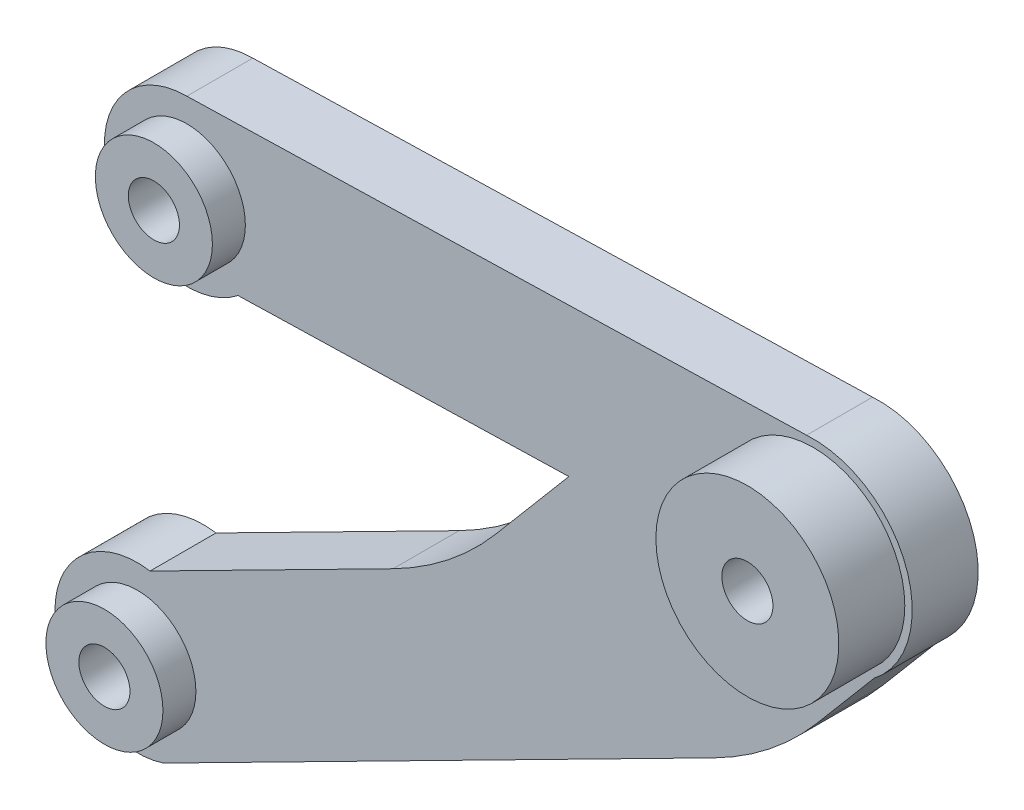
ISO-10303-21;
HEADER;
FILE_DESCRIPTION(('STEP AP214'),'2;1');
FILE_NAME('part.step','',(''),(''),'','','');
FILE_SCHEMA(('AUTOMOTIVE_DESIGN { 1 0 10303 214 1 1 1 1 }'));
ENDSEC;
DATA;
#1=APPLICATION_CONTEXT('core data for automotive mechanical design processes');
#2=APPLICATION_PROTOCOL_DEFINITION('international standard','automotive_design',2000,#1);
#3=PRODUCT_CONTEXT('',#1,'mechanical');
#4=PRODUCT('Part','Part','',(#3));
#5=PRODUCT_RELATED_PRODUCT_CATEGORY('part','',(#4));
#6=PRODUCT_DEFINITION_FORMATION('','',#4);
#7=PRODUCT_DEFINITION_CONTEXT('part definition',#1,'design');
#8=PRODUCT_DEFINITION('design','',#6,#7);
#9=PRODUCT_DEFINITION_SHAPE('','',#8);
#10=(LENGTH_UNIT() NAMED_UNIT(*) SI_UNIT(.MILLI.,.METRE.));
#11=(NAMED_UNIT(*) PLANE_ANGLE_UNIT() SI_UNIT($,.RADIAN.));
#12=(NAMED_UNIT(*) SI_UNIT($,.STERADIAN.) SOLID_ANGLE_UNIT());
#13=UNCERTAINTY_MEASURE_WITH_UNIT(LENGTH_MEASURE(1.E-05),#10,'distance_accuracy_value','');
#14=(GEOMETRIC_REPRESENTATION_CONTEXT(3) GLOBAL_UNCERTAINTY_ASSIGNED_CONTEXT((#13)) GLOBAL_UNIT_ASSIGNED_CONTEXT((#10,
#11,#12)) REPRESENTATION_CONTEXT('',''));
#15=CARTESIAN_POINT('',(0.,0.,0.));
#16=DIRECTION('',(0.,0.,1.));
#17=DIRECTION('',(1.,0.,0.));
#18=AXIS2_PLACEMENT_3D('',#15,#16,#17);
#19=CARTESIAN_POINT('',(0.,0.,2.));
#20=DIRECTION('',(0.,0.,1.));
#21=DIRECTION('',(1.,0.,0.));
#22=AXIS2_PLACEMENT_3D('',#19,#20,#21);
#23=PLANE('',#22);
#24=CARTESIAN_POINT('',(3.,26.,2.));
#25=DIRECTION('',(0.,0.,1.));
#26=DIRECTION('',(1.,0.,0.));
#27=AXIS2_PLACEMENT_3D('',#24,#25,#26);
#28=CIRCLE('',#27,3.54999999999999);
#29=CARTESIAN_POINT('',(6.55,26.,2.));
#30=VERTEX_POINT('',#29);
#31=EDGE_CURVE('E297',#30,#30,#28,.T.);
#32=ORIENTED_EDGE('',*,*,#31,.F.);
#33=EDGE_LOOP('',(#32));
#34=FACE_BOUND('',#33,.T.);
#35=CARTESIAN_POINT('',(41.,26.,2.));
#36=DIRECTION('',(0.,0.,1.));
#37=DIRECTION('',(1.,0.,0.));
#38=AXIS2_PLACEMENT_3D('',#35,#36,#37);
#39=CIRCLE('',#38,5.55);
#40=CARTESIAN_POINT('',(46.55,26.,2.));
#41=VERTEX_POINT('',#40);
#42=EDGE_CURVE('E11',#41,#41,#39,.T.);
#43=ORIENTED_EDGE('',*,*,#42,.F.);
#44=EDGE_LOOP('',(#43));
#45=FACE_BOUND('',#44,.T.);
#46=DIRECTION('',(0.891480958883719,0.453058163978715,0.));
#47=VECTOR('',#46,1.);
#48=CARTESIAN_POINT('',(2.23999683430465,-4.40763390776514,2.));
#49=LINE('',#48,#47);
#50=CARTESIAN_POINT('',(1.57575227360064,-4.74520861208887,2.));
#51=VERTEX_POINT('',#50);
#52=CARTESIAN_POINT('',(34.9980311497331,12.2402762181937,2.));
#53=VERTEX_POINT('',#52);
#54=EDGE_CURVE('E158',#51,#53,#49,.T.);
#55=ORIENTED_EDGE('',*,*,#54,.T.);
#56=CARTESIAN_POINT('',(25.9368678701588,30.0698953958681,2.));
#57=DIRECTION('',(0.,0.,1.));
#58=DIRECTION('',(1.,0.,0.));
#59=AXIS2_PLACEMENT_3D('',#56,#57,#58);
#60=CIRCLE('',#59,20.);
#61=CARTESIAN_POINT('',(41.2064358770203,17.1532281444509,2.));
#62=VERTEX_POINT('',#61);
#63=EDGE_CURVE('E58',#53,#62,#60,.T.);
#64=ORIENTED_EDGE('',*,*,#63,.T.);
#65=DIRECTION('',(0.645833362570859,0.763478400343073,0.));
#66=VECTOR('',#65,1.);
#67=CARTESIAN_POINT('',(15.561290611449,-13.1634380710946,2.));
#68=LINE('',#67,#66);
#69=CARTESIAN_POINT('',(44.6837485343568,21.2639682501461,2.));
#70=VERTEX_POINT('',#69);
#71=EDGE_CURVE('E160',#62,#70,#68,.T.);
#72=ORIENTED_EDGE('',*,*,#71,.T.);
#73=CARTESIAN_POINT('',(41.,26.,2.));
#74=DIRECTION('',(0.,0.,1.));
#75=DIRECTION('',(1.,0.,0.));
#76=AXIS2_PLACEMENT_3D('',#73,#74,#75);
#77=CIRCLE('',#76,6.);
#78=CARTESIAN_POINT('',(40.5908963470243,31.9860366020533,2.));
#79=VERTEX_POINT('',#78);
#80=EDGE_CURVE('E141',#70,#79,#77,.T.);
#81=ORIENTED_EDGE('',*,*,#80,.T.);
#82=DIRECTION('',(0.999656151865712,0.0262217092699197,0.));
#83=VECTOR('',#82,1.);
#84=CARTESIAN_POINT('',(-0.810530748396284,30.9000470018996,2.));
#85=LINE('',#84,#83);
#86=CARTESIAN_POINT('',(3.,31.,2.));
#87=VERTEX_POINT('',#86);
#88=EDGE_CURVE('E123',#87,#79,#85,.T.);
#89=ORIENTED_EDGE('',*,*,#88,.F.);
#90=CARTESIAN_POINT('',(3.,26.,2.));
#91=DIRECTION('',(0.,0.,1.));
#92=DIRECTION('',(1.,0.,0.));
#93=AXIS2_PLACEMENT_3D('',#90,#91,#92);
#94=CIRCLE('',#93,5.);
#95=CARTESIAN_POINT('',(6.10160747242444,22.0782617263513,2.));
#96=VERTEX_POINT('',#95);
#97=EDGE_CURVE('E132',#87,#96,#94,.T.);
#98=ORIENTED_EDGE('',*,*,#97,.T.);
#99=DIRECTION('',(0.999656151865712,0.0262217092699199,0.));
#100=VECTOR('',#99,1.);
#101=CARTESIAN_POINT('',(-0.574535364967009,21.9031416351081,2.));
#102=LINE('',#101,#100);
#103=CARTESIAN_POINT('',(26.1709607270067,22.6046954858943,2.));
#104=VERTEX_POINT('',#103);
#105=EDGE_CURVE('E136',#96,#104,#102,.T.);
#106=ORIENTED_EDGE('',*,*,#105,.T.);
#107=DIRECTION('',(-0.645833362570859,-0.763478400343073,0.));
#108=VECTOR('',#107,1.);
#109=CARTESIAN_POINT('',(4.10911460630286,-3.47593763253173,2.));
#110=LINE('',#109,#108);
#111=CARTESIAN_POINT('',(21.7239611526865,17.3476302457012,2.));
#112=VERTEX_POINT('',#111);
#113=EDGE_CURVE('E150',#104,#112,#110,.T.);
#114=ORIENTED_EDGE('',*,*,#113,.T.);
#115=CARTESIAN_POINT('',(6.45439314582508,30.2642974971184,2.));
#116=DIRECTION('',(0.,0.,1.));
#117=DIRECTION('',(1.,0.,0.));
#118=AXIS2_PLACEMENT_3D('',#115,#116,#117);
#119=CIRCLE('',#118,20.);
#120=CARTESIAN_POINT('',(15.5155564253994,12.434678319444,2.));
#121=VERTEX_POINT('',#120);
#122=EDGE_CURVE('E218',#112,#121,#119,.F.);
#123=ORIENTED_EDGE('',*,*,#122,.T.);
#124=DIRECTION('',(-0.891480958883719,-0.453058163978716,0.));
#125=VECTOR('',#124,1.);
#126=CARTESIAN_POINT('',(-1.83752664150379,3.61569472218833,2.));
#127=LINE('',#126,#125);
#128=CARTESIAN_POINT('',(0.769235560394451,4.9404733227318,2.));
#129=VERTEX_POINT('',#128);
#130=EDGE_CURVE('E153',#121,#129,#127,.T.);
#131=ORIENTED_EDGE('',*,*,#130,.T.);
#132=CARTESIAN_POINT('',(0.,0.,2.));
#133=DIRECTION('',(0.,0.,1.));
#134=DIRECTION('',(1.,0.,0.));
#135=AXIS2_PLACEMENT_3D('',#132,#133,#134);
#136=CIRCLE('',#135,5.);
#137=EDGE_CURVE('E155',#129,#51,#136,.T.);
#138=ORIENTED_EDGE('',*,*,#137,.T.);
#139=EDGE_LOOP('',(#55,#64,#72,#81,#89,#98,#106,#114,#123,#131,#138));
#140=FACE_BOUND('',#139,.T.);
#141=CARTESIAN_POINT('',(0.,0.,2.));
#142=DIRECTION('',(0.,0.,1.));
#143=DIRECTION('',(1.,0.,0.));
#144=AXIS2_PLACEMENT_3D('',#141,#142,#143);
#145=CIRCLE('',#144,3.55);
#146=CARTESIAN_POINT('',(3.55,0.,2.));
#147=VERTEX_POINT('',#146);
#148=EDGE_CURVE('E304',#147,#147,#145,.T.);
#149=ORIENTED_EDGE('',*,*,#148,.F.);
#150=EDGE_LOOP('',(#149));
#151=FACE_BOUND('',#150,.T.);
#152=ADVANCED_FACE('F35',(#34,#45,#140,#151),#23,.T.);
#153=CARTESIAN_POINT('',(-0.810530748396284,30.9000470018996,-2.));
#154=DIRECTION('',(0.0262217092699197,-0.999656151865712,0.));
#155=DIRECTION('',(0.999656151865712,0.0262217092699197,0.));
#156=AXIS2_PLACEMENT_3D('',#153,#154,#155);
#157=PLANE('',#156);
#158=DIRECTION('',(0.,0.,1.));
#159=VECTOR('',#158,1.);
#160=CARTESIAN_POINT('',(3.,31.,-2.));
#161=LINE('',#160,#159);
#162=CARTESIAN_POINT('',(3.,31.,-2.));
#163=VERTEX_POINT('',#162);
#164=EDGE_CURVE('E118',#163,#87,#161,.T.);
#165=ORIENTED_EDGE('',*,*,#164,.T.);
#166=ORIENTED_EDGE('',*,*,#88,.T.);
#167=DIRECTION('',(0.,0.,1.));
#168=VECTOR('',#167,1.);
#169=CARTESIAN_POINT('',(40.5908963470243,31.9860366020533,-2.));
#170=LINE('',#169,#168);
#171=CARTESIAN_POINT('',(40.5908963470243,31.9860366020533,-2.));
#172=VERTEX_POINT('',#171);
#173=EDGE_CURVE('E193',#172,#79,#170,.T.);
#174=ORIENTED_EDGE('',*,*,#173,.F.);
#175=DIRECTION('',(0.999656151865712,0.0262217092699197,0.));
#176=VECTOR('',#175,1.);
#177=CARTESIAN_POINT('',(-0.810530748396284,30.9000470018996,-2.));
#178=LINE('',#177,#176);
#179=EDGE_CURVE('E124',#163,#172,#178,.T.);
#180=ORIENTED_EDGE('',*,*,#179,.F.);
#181=EDGE_LOOP('',(#165,#166,#174,#180));
#182=FACE_BOUND('',#181,.T.);
#183=ADVANCED_FACE('F120',(#182),#157,.F.);
#184=CARTESIAN_POINT('',(41.,26.,-2.));
#185=DIRECTION('',(0.,0.,1.));
#186=DIRECTION('',(1.,0.,0.));
#187=AXIS2_PLACEMENT_3D('',#184,#185,#186);
#188=CYLINDRICAL_SURFACE('',#187,6.);
#189=ORIENTED_EDGE('',*,*,#173,.T.);
#190=ORIENTED_EDGE('',*,*,#80,.F.);
#191=DIRECTION('',(0.,0.,1.));
#192=VECTOR('',#191,1.);
#193=CARTESIAN_POINT('',(44.6837485343568,21.2639682501461,-2.));
#194=LINE('',#193,#192);
#195=CARTESIAN_POINT('',(44.6837485343568,21.2639682501461,-2.));
#196=VERTEX_POINT('',#195);
#197=EDGE_CURVE('E196',#196,#70,#194,.T.);
#198=ORIENTED_EDGE('',*,*,#197,.F.);
#199=CARTESIAN_POINT('',(41.,26.,-2.));
#200=DIRECTION('',(0.,0.,1.));
#201=DIRECTION('',(1.,0.,0.));
#202=AXIS2_PLACEMENT_3D('',#199,#200,#201);
#203=CIRCLE('',#202,6.);
#204=EDGE_CURVE('E129',#196,#172,#203,.T.);
#205=ORIENTED_EDGE('',*,*,#204,.T.);
#206=EDGE_LOOP('',(#189,#190,#198,#205));
#207=FACE_BOUND('',#206,.T.);
#208=ADVANCED_FACE('F251',(#207),#188,.T.);
#209=CARTESIAN_POINT('',(15.561290611449,-13.1634380710946,-2.));
#210=DIRECTION('',(0.763478400343073,-0.645833362570859,0.));
#211=DIRECTION('',(0.645833362570859,0.763478400343073,0.));
#212=AXIS2_PLACEMENT_3D('',#209,#210,#211);
#213=PLANE('',#212);
#214=ORIENTED_EDGE('',*,*,#71,.F.);
#215=DIRECTION('',(0.,0.,1.));
#216=VECTOR('',#215,1.);
#217=CARTESIAN_POINT('',(41.2064358770203,17.1532281444509,-2.));
#218=LINE('',#217,#216);
#219=CARTESIAN_POINT('',(41.2064358770203,17.1532281444509,-2.));
#220=VERTEX_POINT('',#219);
#221=EDGE_CURVE('E50',#62,#220,#218,.F.);
#222=ORIENTED_EDGE('',*,*,#221,.T.);
#223=DIRECTION('',(0.645833362570859,0.763478400343073,0.));
#224=VECTOR('',#223,1.);
#225=CARTESIAN_POINT('',(15.561290611449,-13.1634380710946,-2.));
#226=LINE('',#225,#224);
#227=EDGE_CURVE('E189',#220,#196,#226,.T.);
#228=ORIENTED_EDGE('',*,*,#227,.T.);
#229=ORIENTED_EDGE('',*,*,#197,.T.);
#230=EDGE_LOOP('',(#214,#222,#228,#229));
#231=FACE_BOUND('',#230,.T.);
#232=ADVANCED_FACE('F249',(#231),#213,.T.);
#233=CARTESIAN_POINT('',(2.23999683430465,-4.40763390776514,-2.));
#234=DIRECTION('',(0.453058163978715,-0.891480958883719,0.));
#235=DIRECTION('',(0.891480958883719,0.453058163978715,0.));
#236=AXIS2_PLACEMENT_3D('',#233,#234,#235);
#237=PLANE('',#236);
#238=DIRECTION('',(0.891480958883719,0.453058163978715,0.));
#239=VECTOR('',#238,1.);
#240=CARTESIAN_POINT('',(2.23999683430465,-4.40763390776514,-2.));
#241=LINE('',#240,#239);
#242=CARTESIAN_POINT('',(1.57575227360064,-4.74520861208887,-2.));
#243=VERTEX_POINT('',#242);
#244=CARTESIAN_POINT('',(34.9980311497331,12.2402762181937,-2.));
#245=VERTEX_POINT('',#244);
#246=EDGE_CURVE('E186',#243,#245,#241,.T.);
#247=ORIENTED_EDGE('',*,*,#246,.T.);
#248=DIRECTION('',(0.,0.,1.));
#249=VECTOR('',#248,1.);
#250=CARTESIAN_POINT('',(34.9980311497331,12.2402762181937,-2.));
#251=LINE('',#250,#249);
#252=EDGE_CURVE('E211',#245,#53,#251,.T.);
#253=ORIENTED_EDGE('',*,*,#252,.T.);
#254=ORIENTED_EDGE('',*,*,#54,.F.);
#255=DIRECTION('',(0.,0.,1.));
#256=VECTOR('',#255,1.);
#257=CARTESIAN_POINT('',(1.57575227360064,-4.74520861208887,-2.));
#258=LINE('',#257,#256);
#259=EDGE_CURVE('E199',#243,#51,#258,.T.);
#260=ORIENTED_EDGE('',*,*,#259,.F.);
#261=EDGE_LOOP('',(#247,#253,#254,#260));
#262=FACE_BOUND('',#261,.T.);
#263=ADVANCED_FACE('F242',(#262),#237,.T.);
#264=CARTESIAN_POINT('',(0.,0.,-2.));
#265=DIRECTION('',(0.,0.,1.));
#266=DIRECTION('',(1.,0.,0.));
#267=AXIS2_PLACEMENT_3D('',#264,#265,#266);
#268=CYLINDRICAL_SURFACE('',#267,5.);
#269=ORIENTED_EDGE('',*,*,#259,.T.);
#270=ORIENTED_EDGE('',*,*,#137,.F.);
#271=DIRECTION('',(0.,0.,1.));
#272=VECTOR('',#271,1.);
#273=CARTESIAN_POINT('',(0.769235560394451,4.9404733227318,-2.));
#274=LINE('',#273,#272);
#275=CARTESIAN_POINT('',(0.769235560394451,4.9404733227318,-2.));
#276=VERTEX_POINT('',#275);
#277=EDGE_CURVE('E201',#276,#129,#274,.T.);
#278=ORIENTED_EDGE('',*,*,#277,.F.);
#279=CARTESIAN_POINT('',(0.,0.,-2.));
#280=DIRECTION('',(0.,0.,1.));
#281=DIRECTION('',(1.,0.,0.));
#282=AXIS2_PLACEMENT_3D('',#279,#280,#281);
#283=CIRCLE('',#282,5.);
#284=EDGE_CURVE('E183',#276,#243,#283,.T.);
#285=ORIENTED_EDGE('',*,*,#284,.T.);
#286=EDGE_LOOP('',(#269,#270,#278,#285));
#287=FACE_BOUND('',#286,.T.);
#288=ADVANCED_FACE('F239',(#287),#268,.T.);
#289=CARTESIAN_POINT('',(-1.83752664150379,3.61569472218833,-2.));
#290=DIRECTION('',(-0.453058163978715,0.891480958883719,0.));
#291=DIRECTION('',(-0.891480958883719,-0.453058163978715,0.));
#292=AXIS2_PLACEMENT_3D('',#289,#290,#291);
#293=PLANE('',#292);
#294=ORIENTED_EDGE('',*,*,#130,.F.);
#295=DIRECTION('',(0.,0.,1.));
#296=VECTOR('',#295,1.);
#297=CARTESIAN_POINT('',(15.5155564253994,12.434678319444,-2.));
#298=LINE('',#297,#296);
#299=CARTESIAN_POINT('',(15.5155564253994,12.434678319444,-2.));
#300=VERTEX_POINT('',#299);
#301=EDGE_CURVE('E209',#121,#300,#298,.F.);
#302=ORIENTED_EDGE('',*,*,#301,.T.);
#303=DIRECTION('',(-0.891480958883719,-0.453058163978716,0.));
#304=VECTOR('',#303,1.);
#305=CARTESIAN_POINT('',(-1.83752664150379,3.61569472218833,-2.));
#306=LINE('',#305,#304);
#307=EDGE_CURVE('E181',#300,#276,#306,.T.);
#308=ORIENTED_EDGE('',*,*,#307,.T.);
#309=ORIENTED_EDGE('',*,*,#277,.T.);
#310=EDGE_LOOP('',(#294,#302,#308,#309));
#311=FACE_BOUND('',#310,.T.);
#312=ADVANCED_FACE('F235',(#311),#293,.T.);
#313=CARTESIAN_POINT('',(4.10911460630286,-3.47593763253173,-2.));
#314=DIRECTION('',(-0.763478400343073,0.645833362570859,0.));
#315=DIRECTION('',(-0.645833362570859,-0.763478400343073,0.));
#316=AXIS2_PLACEMENT_3D('',#313,#314,#315);
#317=PLANE('',#316);
#318=DIRECTION('',(-0.645833362570859,-0.763478400343073,0.));
#319=VECTOR('',#318,1.);
#320=CARTESIAN_POINT('',(4.10911460630286,-3.47593763253173,-2.));
#321=LINE('',#320,#319);
#322=CARTESIAN_POINT('',(26.1709607270067,22.6046954858943,-2.));
#323=VERTEX_POINT('',#322);
#324=CARTESIAN_POINT('',(21.7239611526865,17.3476302457012,-2.));
#325=VERTEX_POINT('',#324);
#326=EDGE_CURVE('E178',#323,#325,#321,.T.);
#327=ORIENTED_EDGE('',*,*,#326,.T.);
#328=DIRECTION('',(0.,0.,1.));
#329=VECTOR('',#328,1.);
#330=CARTESIAN_POINT('',(21.7239611526865,17.3476302457012,2.));
#331=LINE('',#330,#329);
#332=EDGE_CURVE('E195',#325,#112,#331,.T.);
#333=ORIENTED_EDGE('',*,*,#332,.T.);
#334=ORIENTED_EDGE('',*,*,#113,.F.);
#335=DIRECTION('',(0.,0.,1.));
#336=VECTOR('',#335,1.);
#337=CARTESIAN_POINT('',(26.1709607270067,22.6046954858943,-2.));
#338=LINE('',#337,#336);
#339=EDGE_CURVE('E204',#323,#104,#338,.T.);
#340=ORIENTED_EDGE('',*,*,#339,.F.);
#341=EDGE_LOOP('',(#327,#333,#334,#340));
#342=FACE_BOUND('',#341,.T.);
#343=ADVANCED_FACE('F230',(#342),#317,.T.);
#344=CARTESIAN_POINT('',(-0.574535364967009,21.9031416351081,-2.));
#345=DIRECTION('',(0.0262217092699199,-0.999656151865712,0.));
#346=DIRECTION('',(0.999656151865712,0.0262217092699199,0.));
#347=AXIS2_PLACEMENT_3D('',#344,#345,#346);
#348=PLANE('',#347);
#349=ORIENTED_EDGE('',*,*,#339,.T.);
#350=ORIENTED_EDGE('',*,*,#105,.F.);
#351=DIRECTION('',(0.,0.,1.));
#352=VECTOR('',#351,1.);
#353=CARTESIAN_POINT('',(6.10160747242444,22.0782617263513,-2.));
#354=LINE('',#353,#352);
#355=CARTESIAN_POINT('',(6.10160747242444,22.0782617263513,-2.));
#356=VERTEX_POINT('',#355);
#357=EDGE_CURVE('E128',#356,#96,#354,.T.);
#358=ORIENTED_EDGE('',*,*,#357,.F.);
#359=DIRECTION('',(0.999656151865712,0.0262217092699199,0.));
#360=VECTOR('',#359,1.);
#361=CARTESIAN_POINT('',(-0.574535364967009,21.9031416351081,-2.));
#362=LINE('',#361,#360);
#363=EDGE_CURVE('E175',#356,#323,#362,.T.);
#364=ORIENTED_EDGE('',*,*,#363,.T.);
#365=EDGE_LOOP('',(#349,#350,#358,#364));
#366=FACE_BOUND('',#365,.T.);
#367=ADVANCED_FACE('F291',(#366),#348,.T.);
#368=CARTESIAN_POINT('',(3.,26.,-2.));
#369=DIRECTION('',(0.,0.,1.));
#370=DIRECTION('',(1.,0.,0.));
#371=AXIS2_PLACEMENT_3D('',#368,#369,#370);
#372=CYLINDRICAL_SURFACE('',#371,1.54999999999999);
#373=CARTESIAN_POINT('',(3.,26.,-2.));
#374=DIRECTION('',(0.,0.,1.));
#375=DIRECTION('',(1.,0.,0.));
#376=AXIS2_PLACEMENT_3D('',#373,#374,#375);
#377=CIRCLE('',#376,1.54999999999999);
#378=CARTESIAN_POINT('',(4.54999999999999,26.,-2.));
#379=VERTEX_POINT('',#378);
#380=EDGE_CURVE('E169',#379,#379,#377,.T.);
#381=ORIENTED_EDGE('',*,*,#380,.F.);
#382=EDGE_LOOP('',(#381));
#383=FACE_BOUND('',#382,.T.);
#384=CARTESIAN_POINT('',(3.,26.,4.));
#385=DIRECTION('',(0.,0.,1.));
#386=DIRECTION('',(1.,0.,0.));
#387=AXIS2_PLACEMENT_3D('',#384,#385,#386);
#388=CIRCLE('',#387,1.54999999999999);
#389=CARTESIAN_POINT('',(4.55,26.,4.));
#390=VERTEX_POINT('',#389);
#391=EDGE_CURVE('E295',#390,#390,#388,.T.);
#392=ORIENTED_EDGE('',*,*,#391,.T.);
#393=EDGE_LOOP('',(#392));
#394=FACE_BOUND('',#393,.T.);
#395=ADVANCED_FACE('F287',(#383,#394),#372,.F.);
#396=CARTESIAN_POINT('',(41.,26.,-2.));
#397=DIRECTION('',(0.,0.,1.));
#398=DIRECTION('',(1.,0.,0.));
#399=AXIS2_PLACEMENT_3D('',#396,#397,#398);
#400=CYLINDRICAL_SURFACE('',#399,1.54999999999999);
#401=CARTESIAN_POINT('',(41.,26.,-2.));
#402=DIRECTION('',(0.,0.,1.));
#403=DIRECTION('',(1.,0.,0.));
#404=AXIS2_PLACEMENT_3D('',#401,#402,#403);
#405=CIRCLE('',#404,1.54999999999999);
#406=CARTESIAN_POINT('',(42.55,26.,-2.));
#407=VERTEX_POINT('',#406);
#408=EDGE_CURVE('E166',#407,#407,#405,.T.);
#409=ORIENTED_EDGE('',*,*,#408,.F.);
#410=EDGE_LOOP('',(#409));
#411=FACE_BOUND('',#410,.T.);
#412=CARTESIAN_POINT('',(41.,26.,6.));
#413=DIRECTION('',(0.,0.,-1.));
#414=DIRECTION('',(-1.,0.,0.));
#415=AXIS2_PLACEMENT_3D('',#412,#413,#414);
#416=CIRCLE('',#415,1.55);
#417=CARTESIAN_POINT('',(39.45,26.,6.));
#418=VERTEX_POINT('',#417);
#419=EDGE_CURVE('E145',#418,#418,#416,.T.);
#420=ORIENTED_EDGE('',*,*,#419,.F.);
#421=EDGE_LOOP('',(#420));
#422=FACE_BOUND('',#421,.T.);
#423=ADVANCED_FACE('F290',(#411,#422),#400,.F.);
#424=CARTESIAN_POINT('',(0.,0.,-2.));
#425=DIRECTION('',(0.,0.,1.));
#426=DIRECTION('',(1.,0.,0.));
#427=AXIS2_PLACEMENT_3D('',#424,#425,#426);
#428=CYLINDRICAL_SURFACE('',#427,1.55);
#429=CARTESIAN_POINT('',(0.,0.,-2.));
#430=DIRECTION('',(0.,0.,1.));
#431=DIRECTION('',(1.,0.,0.));
#432=AXIS2_PLACEMENT_3D('',#429,#430,#431);
#433=CIRCLE('',#432,1.55);
#434=CARTESIAN_POINT('',(1.55,0.,-2.));
#435=VERTEX_POINT('',#434);
#436=EDGE_CURVE('E163',#435,#435,#433,.T.);
#437=ORIENTED_EDGE('',*,*,#436,.F.);
#438=EDGE_LOOP('',(#437));
#439=FACE_BOUND('',#438,.T.);
#440=CARTESIAN_POINT('',(0.,0.,4.));
#441=DIRECTION('',(0.,0.,1.));
#442=DIRECTION('',(1.,0.,0.));
#443=AXIS2_PLACEMENT_3D('',#440,#441,#442);
#444=CIRCLE('',#443,1.55);
#445=CARTESIAN_POINT('',(1.55,0.,4.));
#446=VERTEX_POINT('',#445);
#447=EDGE_CURVE('E486',#446,#446,#444,.T.);
#448=ORIENTED_EDGE('',*,*,#447,.T.);
#449=EDGE_LOOP('',(#448));
#450=FACE_BOUND('',#449,.T.);
#451=ADVANCED_FACE('F279',(#439,#450),#428,.F.);
#452=CARTESIAN_POINT('',(3.,26.,-2.));
#453=DIRECTION('',(0.,0.,1.));
#454=DIRECTION('',(1.,0.,0.));
#455=AXIS2_PLACEMENT_3D('',#452,#453,#454);
#456=CYLINDRICAL_SURFACE('',#455,5.);
#457=ORIENTED_EDGE('',*,*,#357,.T.);
#458=ORIENTED_EDGE('',*,*,#97,.F.);
#459=ORIENTED_EDGE('',*,*,#164,.F.);
#460=CARTESIAN_POINT('',(3.,26.,-2.));
#461=DIRECTION('',(0.,0.,1.));
#462=DIRECTION('',(1.,0.,0.));
#463=AXIS2_PLACEMENT_3D('',#460,#461,#462);
#464=CIRCLE('',#463,5.);
#465=EDGE_CURVE('E173',#163,#356,#464,.T.);
#466=ORIENTED_EDGE('',*,*,#465,.T.);
#467=EDGE_LOOP('',(#457,#458,#459,#466));
#468=FACE_BOUND('',#467,.T.);
#469=ADVANCED_FACE('F133',(#468),#456,.T.);
#470=CARTESIAN_POINT('',(0.,0.,-2.));
#471=DIRECTION('',(0.,0.,1.));
#472=DIRECTION('',(1.,0.,0.));
#473=AXIS2_PLACEMENT_3D('',#470,#471,#472);
#474=PLANE('',#473);
#475=ORIENTED_EDGE('',*,*,#436,.T.);
#476=EDGE_LOOP('',(#475));
#477=FACE_BOUND('',#476,.T.);
#478=ORIENTED_EDGE('',*,*,#408,.T.);
#479=EDGE_LOOP('',(#478));
#480=FACE_BOUND('',#479,.T.);
#481=ORIENTED_EDGE('',*,*,#380,.T.);
#482=EDGE_LOOP('',(#481));
#483=FACE_BOUND('',#482,.T.);
#484=ORIENTED_EDGE('',*,*,#227,.F.);
#485=CARTESIAN_POINT('',(25.9368678701588,30.0698953958681,-2.));
#486=DIRECTION('',(0.,0.,1.));
#487=DIRECTION('',(1.,0.,0.));
#488=AXIS2_PLACEMENT_3D('',#485,#486,#487);
#489=CIRCLE('',#488,20.);
#490=EDGE_CURVE('E216',#220,#245,#489,.F.);
#491=ORIENTED_EDGE('',*,*,#490,.T.);
#492=ORIENTED_EDGE('',*,*,#246,.F.);
#493=ORIENTED_EDGE('',*,*,#284,.F.);
#494=ORIENTED_EDGE('',*,*,#307,.F.);
#495=CARTESIAN_POINT('',(6.45439314582508,30.2642974971184,-2.));
#496=DIRECTION('',(0.,0.,1.));
#497=DIRECTION('',(1.,0.,0.));
#498=AXIS2_PLACEMENT_3D('',#495,#496,#497);
#499=CIRCLE('',#498,20.);
#500=EDGE_CURVE('E43',#300,#325,#499,.T.);
#501=ORIENTED_EDGE('',*,*,#500,.T.);
#502=ORIENTED_EDGE('',*,*,#326,.F.);
#503=ORIENTED_EDGE('',*,*,#363,.F.);
#504=ORIENTED_EDGE('',*,*,#465,.F.);
#505=ORIENTED_EDGE('',*,*,#179,.T.);
#506=ORIENTED_EDGE('',*,*,#204,.F.);
#507=EDGE_LOOP('',(#484,#491,#492,#493,#494,#501,#502,#503,#504,#505,#506));
#508=FACE_BOUND('',#507,.T.);
#509=ADVANCED_FACE('F223',(#477,#480,#483,#508),#474,.F.);
#510=CARTESIAN_POINT('',(6.45439314582508,30.2642974971184,-2.));
#511=DIRECTION('',(0.,0.,-1.));
#512=DIRECTION('',(-1.,0.,0.));
#513=AXIS2_PLACEMENT_3D('',#510,#511,#512);
#514=CYLINDRICAL_SURFACE('',#513,20.);
#515=ORIENTED_EDGE('',*,*,#500,.F.);
#516=ORIENTED_EDGE('',*,*,#301,.F.);
#517=ORIENTED_EDGE('',*,*,#122,.F.);
#518=ORIENTED_EDGE('',*,*,#332,.F.);
#519=EDGE_LOOP('',(#515,#516,#517,#518));
#520=FACE_BOUND('',#519,.T.);
#521=ADVANCED_FACE('F232',(#520),#514,.F.);
#522=CARTESIAN_POINT('',(25.9368678701588,30.0698953958681,-2.));
#523=DIRECTION('',(0.,0.,1.));
#524=DIRECTION('',(1.,0.,0.));
#525=AXIS2_PLACEMENT_3D('',#522,#523,#524);
#526=CYLINDRICAL_SURFACE('',#525,20.);
#527=ORIENTED_EDGE('',*,*,#490,.F.);
#528=ORIENTED_EDGE('',*,*,#221,.F.);
#529=ORIENTED_EDGE('',*,*,#63,.F.);
#530=ORIENTED_EDGE('',*,*,#252,.F.);
#531=EDGE_LOOP('',(#527,#528,#529,#530));
#532=FACE_BOUND('',#531,.T.);
#533=ADVANCED_FACE('F37',(#532),#526,.T.);
#534=CARTESIAN_POINT('',(41.,26.,6.));
#535=DIRECTION('',(0.,0.,-1.));
#536=DIRECTION('',(-1.,0.,0.));
#537=AXIS2_PLACEMENT_3D('',#534,#535,#536);
#538=CYLINDRICAL_SURFACE('',#537,5.55);
#539=CARTESIAN_POINT('',(41.,26.,6.));
#540=DIRECTION('',(0.,0.,-1.));
#541=DIRECTION('',(-1.,0.,0.));
#542=AXIS2_PLACEMENT_3D('',#539,#540,#541);
#543=CIRCLE('',#542,5.55);
#544=CARTESIAN_POINT('',(35.45,26.,6.));
#545=VERTEX_POINT('',#544);
#546=EDGE_CURVE('E142',#545,#545,#543,.T.);
#547=ORIENTED_EDGE('',*,*,#546,.T.);
#548=EDGE_LOOP('',(#547));
#549=FACE_BOUND('',#548,.T.);
#550=ORIENTED_EDGE('',*,*,#42,.T.);
#551=EDGE_LOOP('',(#550));
#552=FACE_BOUND('',#551,.T.);
#553=ADVANCED_FACE('F271',(#549,#552),#538,.T.);
#554=CARTESIAN_POINT('',(41.,26.,6.));
#555=DIRECTION('',(0.,0.,-1.));
#556=DIRECTION('',(-1.,0.,0.));
#557=AXIS2_PLACEMENT_3D('',#554,#555,#556);
#558=PLANE('',#557);
#559=ORIENTED_EDGE('',*,*,#419,.T.);
#560=EDGE_LOOP('',(#559));
#561=FACE_BOUND('',#560,.T.);
#562=ORIENTED_EDGE('',*,*,#546,.F.);
#563=EDGE_LOOP('',(#562));
#564=FACE_BOUND('',#563,.T.);
#565=ADVANCED_FACE('F312',(#561,#564),#558,.F.);
#566=CARTESIAN_POINT('',(3.,26.,4.));
#567=DIRECTION('',(0.,0.,1.));
#568=DIRECTION('',(1.,0.,0.));
#569=AXIS2_PLACEMENT_3D('',#566,#567,#568);
#570=PLANE('',#569);
#571=CARTESIAN_POINT('',(3.,26.,4.));
#572=DIRECTION('',(0.,0.,1.));
#573=DIRECTION('',(1.,0.,0.));
#574=AXIS2_PLACEMENT_3D('',#571,#572,#573);
#575=CIRCLE('',#574,3.54999999999999);
#576=CARTESIAN_POINT('',(6.55,26.,4.));
#577=VERTEX_POINT('',#576);
#578=EDGE_CURVE('E301',#577,#577,#575,.T.);
#579=ORIENTED_EDGE('',*,*,#578,.T.);
#580=EDGE_LOOP('',(#579));
#581=FACE_BOUND('',#580,.T.);
#582=ORIENTED_EDGE('',*,*,#391,.F.);
#583=EDGE_LOOP('',(#582));
#584=FACE_BOUND('',#583,.T.);
#585=ADVANCED_FACE('F408',(#581,#584),#570,.T.);
#586=CARTESIAN_POINT('',(3.,26.,4.));
#587=DIRECTION('',(0.,0.,-1.));
#588=DIRECTION('',(-1.,0.,0.));
#589=AXIS2_PLACEMENT_3D('',#586,#587,#588);
#590=CYLINDRICAL_SURFACE('',#589,3.54999999999999);
#591=ORIENTED_EDGE('',*,*,#578,.F.);
#592=EDGE_LOOP('',(#591));
#593=FACE_BOUND('',#592,.T.);
#594=ORIENTED_EDGE('',*,*,#31,.T.);
#595=EDGE_LOOP('',(#594));
#596=FACE_BOUND('',#595,.T.);
#597=ADVANCED_FACE('F413',(#593,#596),#590,.T.);
#598=CARTESIAN_POINT('',(0.,0.,4.));
#599=DIRECTION('',(0.,0.,1.));
#600=DIRECTION('',(1.,0.,0.));
#601=AXIS2_PLACEMENT_3D('',#598,#599,#600);
#602=PLANE('',#601);
#603=CARTESIAN_POINT('',(0.,0.,4.));
#604=DIRECTION('',(0.,0.,1.));
#605=DIRECTION('',(1.,0.,0.));
#606=AXIS2_PLACEMENT_3D('',#603,#604,#605);
#607=CIRCLE('',#606,3.55);
#608=CARTESIAN_POINT('',(3.55,0.,4.));
#609=VERTEX_POINT('',#608);
#610=EDGE_CURVE('E298',#609,#609,#607,.T.);
#611=ORIENTED_EDGE('',*,*,#610,.T.);
#612=EDGE_LOOP('',(#611));
#613=FACE_BOUND('',#612,.T.);
#614=ORIENTED_EDGE('',*,*,#447,.F.);
#615=EDGE_LOOP('',(#614));
#616=FACE_BOUND('',#615,.T.);
#617=ADVANCED_FACE('F422',(#613,#616),#602,.T.);
#618=CARTESIAN_POINT('',(0.,0.,4.));
#619=DIRECTION('',(0.,0.,-1.));
#620=DIRECTION('',(-1.,0.,0.));
#621=AXIS2_PLACEMENT_3D('',#618,#619,#620);
#622=CYLINDRICAL_SURFACE('',#621,3.55);
#623=ORIENTED_EDGE('',*,*,#610,.F.);
#624=EDGE_LOOP('',(#623));
#625=FACE_BOUND('',#624,.T.);
#626=ORIENTED_EDGE('',*,*,#148,.T.);
#627=EDGE_LOOP('',(#626));
#628=FACE_BOUND('',#627,.T.);
#629=ADVANCED_FACE('F431',(#625,#628),#622,.T.);
#630=CLOSED_SHELL('',(#152,#183,#208,#232,#263,#288,#312,#343,#367,#395,#423,#451,#469,#509,
#521,#533,#553,#565,#585,#597,#617,#629));
#631=MANIFOLD_SOLID_BREP('B2',#630);
#632=ADVANCED_BREP_SHAPE_REPRESENTATION('',(#18,#631),#14);
#633=SHAPE_DEFINITION_REPRESENTATION(#9,#632);
ENDSEC;
END-ISO-10303-21;
